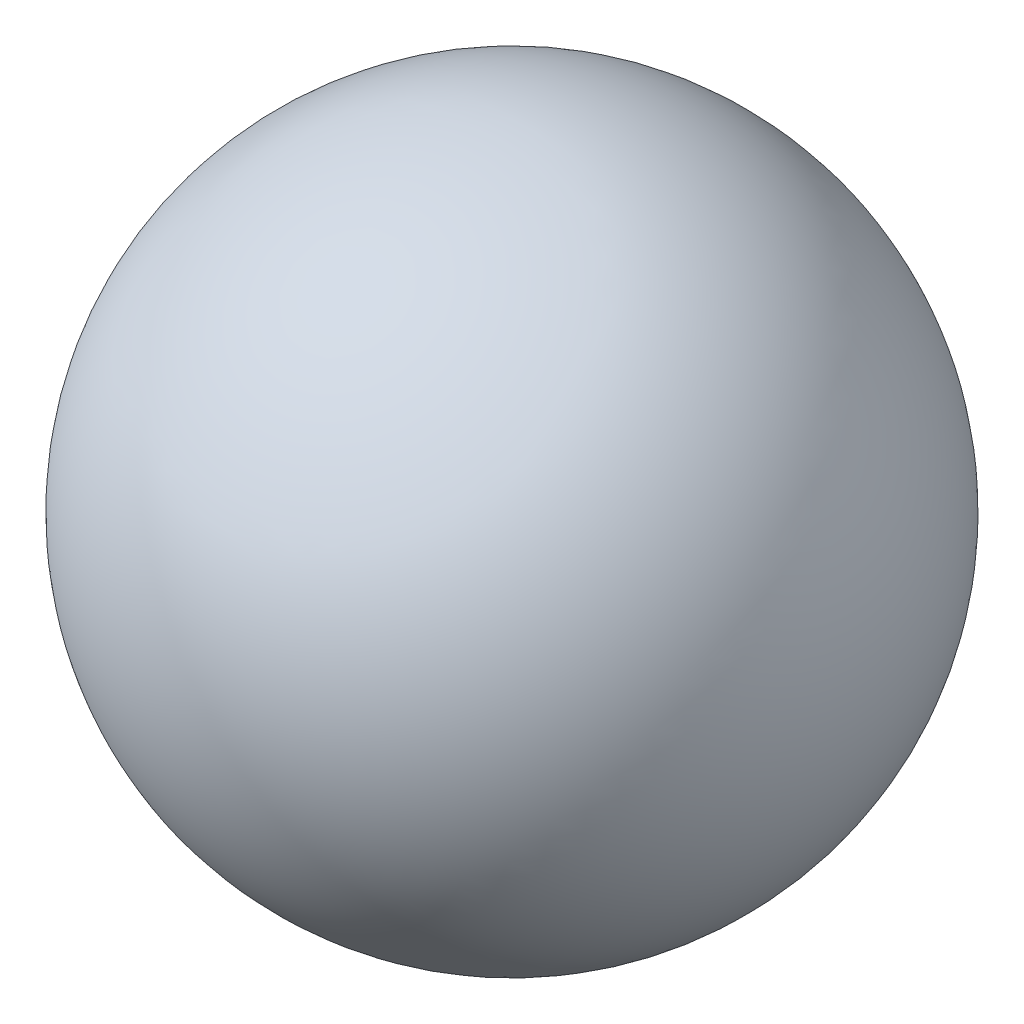
ISO-10303-21;
HEADER;
FILE_DESCRIPTION(('STEP AP214'),'2;1');
FILE_NAME('part.step','',(''),(''),'','','');
FILE_SCHEMA(('AUTOMOTIVE_DESIGN { 1 0 10303 214 1 1 1 1 }'));
ENDSEC;
DATA;
#1=APPLICATION_CONTEXT('core data for automotive mechanical design processes');
#2=APPLICATION_PROTOCOL_DEFINITION('international standard','automotive_design',2000,#1);
#3=PRODUCT_CONTEXT('',#1,'mechanical');
#4=PRODUCT('Part','Part','',(#3));
#5=PRODUCT_RELATED_PRODUCT_CATEGORY('part','',(#4));
#6=PRODUCT_DEFINITION_FORMATION('','',#4);
#7=PRODUCT_DEFINITION_CONTEXT('part definition',#1,'design');
#8=PRODUCT_DEFINITION('design','',#6,#7);
#9=PRODUCT_DEFINITION_SHAPE('','',#8);
#10=(LENGTH_UNIT() NAMED_UNIT(*) SI_UNIT(.MILLI.,.METRE.));
#11=(NAMED_UNIT(*) PLANE_ANGLE_UNIT() SI_UNIT($,.RADIAN.));
#12=(NAMED_UNIT(*) SI_UNIT($,.STERADIAN.) SOLID_ANGLE_UNIT());
#13=UNCERTAINTY_MEASURE_WITH_UNIT(LENGTH_MEASURE(1.E-05),#10,'distance_accuracy_value','');
#14=(GEOMETRIC_REPRESENTATION_CONTEXT(3) GLOBAL_UNCERTAINTY_ASSIGNED_CONTEXT((#13)) GLOBAL_UNIT_ASSIGNED_CONTEXT((#10,
#11,#12)) REPRESENTATION_CONTEXT('',''));
#15=CARTESIAN_POINT('',(0.,0.,0.));
#16=DIRECTION('',(0.,0.,1.));
#17=DIRECTION('',(1.,0.,0.));
#18=AXIS2_PLACEMENT_3D('',#15,#16,#17);
#19=CARTESIAN_POINT('',(0.,0.,0.));
#20=DIRECTION('',(0.,0.,-1.));
#21=DIRECTION('',(1.,0.,0.));
#22=AXIS2_PLACEMENT_3D('',#19,#20,#21);
#23=SPHERICAL_SURFACE('',#22,0.625);
#24=CARTESIAN_POINT('',(0.,0.,-0.625));
#25=VERTEX_POINT('',#24);
#26=VERTEX_LOOP('',#25);
#27=FACE_BOUND('',#26,.T.);
#28=ADVANCED_FACE('F34',(#27),#23,.T.);
#29=CLOSED_SHELL('',(#28));
#30=MANIFOLD_SOLID_BREP('B2',#29);
#31=ADVANCED_BREP_SHAPE_REPRESENTATION('',(#18,#30),#14);
#32=SHAPE_DEFINITION_REPRESENTATION(#9,#31);
ENDSEC;
END-ISO-10303-21;
